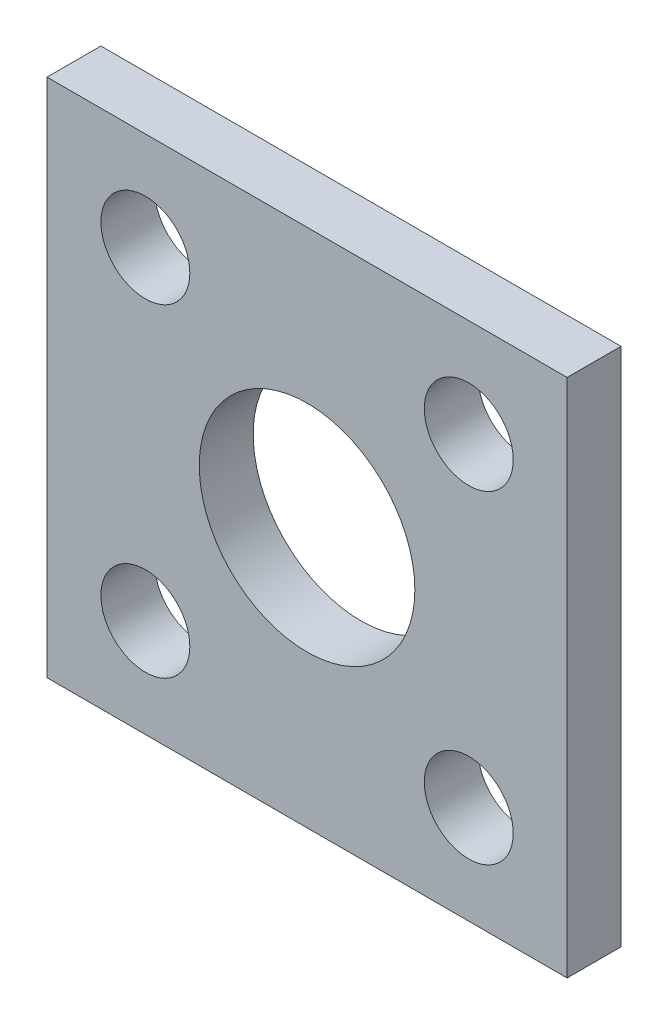
ISO-10303-21;
HEADER;
FILE_DESCRIPTION(('STEP AP214'),'2;1');
FILE_NAME('part.step','',(''),(''),'','','');
FILE_SCHEMA(('AUTOMOTIVE_DESIGN { 1 0 10303 214 1 1 1 1 }'));
ENDSEC;
DATA;
#1=APPLICATION_CONTEXT('core data for automotive mechanical design processes');
#2=APPLICATION_PROTOCOL_DEFINITION('international standard','automotive_design',2000,#1);
#3=PRODUCT_CONTEXT('',#1,'mechanical');
#4=PRODUCT('Part','Part','',(#3));
#5=PRODUCT_RELATED_PRODUCT_CATEGORY('part','',(#4));
#6=PRODUCT_DEFINITION_FORMATION('','',#4);
#7=PRODUCT_DEFINITION_CONTEXT('part definition',#1,'design');
#8=PRODUCT_DEFINITION('design','',#6,#7);
#9=PRODUCT_DEFINITION_SHAPE('','',#8);
#10=(LENGTH_UNIT() NAMED_UNIT(*) SI_UNIT(.MILLI.,.METRE.));
#11=(NAMED_UNIT(*) PLANE_ANGLE_UNIT() SI_UNIT($,.RADIAN.));
#12=(NAMED_UNIT(*) SI_UNIT($,.STERADIAN.) SOLID_ANGLE_UNIT());
#13=UNCERTAINTY_MEASURE_WITH_UNIT(LENGTH_MEASURE(1.E-05),#10,'distance_accuracy_value','');
#14=(GEOMETRIC_REPRESENTATION_CONTEXT(3) GLOBAL_UNCERTAINTY_ASSIGNED_CONTEXT((#13)) GLOBAL_UNIT_ASSIGNED_CONTEXT((#10,
#11,#12)) REPRESENTATION_CONTEXT('',''));
#15=CARTESIAN_POINT('',(0.,0.,0.));
#16=DIRECTION('',(0.,0.,1.));
#17=DIRECTION('',(1.,0.,0.));
#18=AXIS2_PLACEMENT_3D('',#15,#16,#17);
#19=CARTESIAN_POINT('',(0.,0.,5.));
#20=DIRECTION('',(0.,1.,0.));
#21=DIRECTION('',(0.,0.,1.));
#22=AXIS2_PLACEMENT_3D('',#19,#20,#21);
#23=PLANE('',#22);
#24=DIRECTION('',(1.,0.,0.));
#25=VECTOR('',#24,1.);
#26=CARTESIAN_POINT('',(0.,0.,0.));
#27=LINE('',#26,#25);
#28=CARTESIAN_POINT('',(0.,0.,0.));
#29=VERTEX_POINT('',#28);
#30=CARTESIAN_POINT('',(48.25,0.,0.));
#31=VERTEX_POINT('',#30);
#32=EDGE_CURVE('E115',#29,#31,#27,.T.);
#33=ORIENTED_EDGE('',*,*,#32,.T.);
#34=DIRECTION('',(0.,0.,-1.));
#35=VECTOR('',#34,1.);
#36=CARTESIAN_POINT('',(48.25,0.,5.));
#37=LINE('',#36,#35);
#38=CARTESIAN_POINT('',(48.25,0.,5.));
#39=VERTEX_POINT('',#38);
#40=EDGE_CURVE('E11',#39,#31,#37,.T.);
#41=ORIENTED_EDGE('',*,*,#40,.F.);
#42=DIRECTION('',(1.,0.,0.));
#43=VECTOR('',#42,1.);
#44=CARTESIAN_POINT('',(0.,0.,5.));
#45=LINE('',#44,#43);
#46=CARTESIAN_POINT('',(0.,0.,5.));
#47=VERTEX_POINT('',#46);
#48=EDGE_CURVE('E86',#47,#39,#45,.T.);
#49=ORIENTED_EDGE('',*,*,#48,.F.);
#50=DIRECTION('',(0.,0.,-1.));
#51=VECTOR('',#50,1.);
#52=CARTESIAN_POINT('',(0.,0.,5.));
#53=LINE('',#52,#51);
#54=EDGE_CURVE('E52',#47,#29,#53,.T.);
#55=ORIENTED_EDGE('',*,*,#54,.T.);
#56=EDGE_LOOP('',(#33,#41,#49,#55));
#57=FACE_BOUND('',#56,.T.);
#58=ADVANCED_FACE('F35',(#57),#23,.F.);
#59=CARTESIAN_POINT('',(48.25,0.,5.));
#60=DIRECTION('',(-1.,0.,0.));
#61=DIRECTION('',(0.,-1.,0.));
#62=AXIS2_PLACEMENT_3D('',#59,#60,#61);
#63=PLANE('',#62);
#64=DIRECTION('',(0.,1.,0.));
#65=VECTOR('',#64,1.);
#66=CARTESIAN_POINT('',(48.25,0.,0.));
#67=LINE('',#66,#65);
#68=CARTESIAN_POINT('',(48.25,48.25,0.));
#69=VERTEX_POINT('',#68);
#70=EDGE_CURVE('E91',#31,#69,#67,.T.);
#71=ORIENTED_EDGE('',*,*,#70,.T.);
#72=DIRECTION('',(0.,0.,-1.));
#73=VECTOR('',#72,1.);
#74=CARTESIAN_POINT('',(48.25,48.25,5.));
#75=LINE('',#74,#73);
#76=CARTESIAN_POINT('',(48.25,48.25,5.));
#77=VERTEX_POINT('',#76);
#78=EDGE_CURVE('E44',#77,#69,#75,.T.);
#79=ORIENTED_EDGE('',*,*,#78,.F.);
#80=DIRECTION('',(0.,1.,0.));
#81=VECTOR('',#80,1.);
#82=CARTESIAN_POINT('',(48.25,0.,5.));
#83=LINE('',#82,#81);
#84=EDGE_CURVE('E77',#39,#77,#83,.T.);
#85=ORIENTED_EDGE('',*,*,#84,.F.);
#86=ORIENTED_EDGE('',*,*,#40,.T.);
#87=EDGE_LOOP('',(#71,#79,#85,#86));
#88=FACE_BOUND('',#87,.T.);
#89=ADVANCED_FACE('F90',(#88),#63,.F.);
#90=CARTESIAN_POINT('',(0.,48.25,5.));
#91=DIRECTION('',(0.,1.,0.));
#92=DIRECTION('',(0.,0.,1.));
#93=AXIS2_PLACEMENT_3D('',#90,#91,#92);
#94=PLANE('',#93);
#95=DIRECTION('',(1.,0.,0.));
#96=VECTOR('',#95,1.);
#97=CARTESIAN_POINT('',(0.,48.25,0.));
#98=LINE('',#97,#96);
#99=CARTESIAN_POINT('',(0.,48.25,0.));
#100=VERTEX_POINT('',#99);
#101=EDGE_CURVE('E118',#100,#69,#98,.T.);
#102=ORIENTED_EDGE('',*,*,#101,.F.);
#103=DIRECTION('',(0.,0.,-1.));
#104=VECTOR('',#103,1.);
#105=CARTESIAN_POINT('',(0.,48.25,5.));
#106=LINE('',#105,#104);
#107=CARTESIAN_POINT('',(0.,48.25,5.));
#108=VERTEX_POINT('',#107);
#109=EDGE_CURVE('E66',#108,#100,#106,.T.);
#110=ORIENTED_EDGE('',*,*,#109,.F.);
#111=DIRECTION('',(1.,0.,0.));
#112=VECTOR('',#111,1.);
#113=CARTESIAN_POINT('',(0.,48.25,5.));
#114=LINE('',#113,#112);
#115=EDGE_CURVE('E85',#108,#77,#114,.T.);
#116=ORIENTED_EDGE('',*,*,#115,.T.);
#117=ORIENTED_EDGE('',*,*,#78,.T.);
#118=EDGE_LOOP('',(#102,#110,#116,#117));
#119=FACE_BOUND('',#118,.T.);
#120=ADVANCED_FACE('F94',(#119),#94,.T.);
#121=CARTESIAN_POINT('',(9.125,9.12500000000001,5.));
#122=DIRECTION('',(0.,0.,-1.));
#123=DIRECTION('',(-1.,0.,0.));
#124=AXIS2_PLACEMENT_3D('',#121,#122,#123);
#125=CYLINDRICAL_SURFACE('',#124,4.125);
#126=CARTESIAN_POINT('',(9.125,9.12500000000001,5.));
#127=DIRECTION('',(0.,0.,1.));
#128=DIRECTION('',(1.,0.,0.));
#129=AXIS2_PLACEMENT_3D('',#126,#127,#128);
#130=CIRCLE('',#129,4.125);
#131=CARTESIAN_POINT('',(13.25,9.12500000000001,5.));
#132=VERTEX_POINT('',#131);
#133=EDGE_CURVE('E103',#132,#132,#130,.T.);
#134=ORIENTED_EDGE('',*,*,#133,.T.);
#135=EDGE_LOOP('',(#134));
#136=FACE_BOUND('',#135,.T.);
#137=CARTESIAN_POINT('',(9.125,9.12500000000001,0.));
#138=DIRECTION('',(0.,0.,1.));
#139=DIRECTION('',(1.,0.,0.));
#140=AXIS2_PLACEMENT_3D('',#137,#138,#139);
#141=CIRCLE('',#140,4.125);
#142=CARTESIAN_POINT('',(13.25,9.12500000000001,0.));
#143=VERTEX_POINT('',#142);
#144=EDGE_CURVE('E126',#143,#143,#141,.T.);
#145=ORIENTED_EDGE('',*,*,#144,.F.);
#146=EDGE_LOOP('',(#145));
#147=FACE_BOUND('',#146,.T.);
#148=ADVANCED_FACE('F179',(#136,#147),#125,.F.);
#149=CARTESIAN_POINT('',(39.125,39.125,5.));
#150=DIRECTION('',(0.,0.,-1.));
#151=DIRECTION('',(-1.,0.,0.));
#152=AXIS2_PLACEMENT_3D('',#149,#150,#151);
#153=CYLINDRICAL_SURFACE('',#152,4.12499999999999);
#154=CARTESIAN_POINT('',(39.125,39.125,5.));
#155=DIRECTION('',(0.,0.,1.));
#156=DIRECTION('',(1.,0.,0.));
#157=AXIS2_PLACEMENT_3D('',#154,#155,#156);
#158=CIRCLE('',#157,4.12499999999999);
#159=CARTESIAN_POINT('',(43.25,39.125,5.));
#160=VERTEX_POINT('',#159);
#161=EDGE_CURVE('E97',#160,#160,#158,.T.);
#162=ORIENTED_EDGE('',*,*,#161,.T.);
#163=EDGE_LOOP('',(#162));
#164=FACE_BOUND('',#163,.T.);
#165=CARTESIAN_POINT('',(39.125,39.125,0.));
#166=DIRECTION('',(0.,0.,1.));
#167=DIRECTION('',(1.,0.,0.));
#168=AXIS2_PLACEMENT_3D('',#165,#166,#167);
#169=CIRCLE('',#168,4.12499999999999);
#170=CARTESIAN_POINT('',(43.25,39.125,0.));
#171=VERTEX_POINT('',#170);
#172=EDGE_CURVE('E123',#171,#171,#169,.T.);
#173=ORIENTED_EDGE('',*,*,#172,.F.);
#174=EDGE_LOOP('',(#173));
#175=FACE_BOUND('',#174,.T.);
#176=ADVANCED_FACE('F174',(#164,#175),#153,.F.);
#177=CARTESIAN_POINT('',(0.,0.,5.));
#178=DIRECTION('',(-1.,0.,0.));
#179=DIRECTION('',(0.,-1.,0.));
#180=AXIS2_PLACEMENT_3D('',#177,#178,#179);
#181=PLANE('',#180);
#182=DIRECTION('',(0.,1.,0.));
#183=VECTOR('',#182,1.);
#184=CARTESIAN_POINT('',(0.,0.,0.));
#185=LINE('',#184,#183);
#186=EDGE_CURVE('E120',#29,#100,#185,.T.);
#187=ORIENTED_EDGE('',*,*,#186,.F.);
#188=ORIENTED_EDGE('',*,*,#54,.F.);
#189=DIRECTION('',(0.,1.,0.));
#190=VECTOR('',#189,1.);
#191=CARTESIAN_POINT('',(0.,0.,5.));
#192=LINE('',#191,#190);
#193=EDGE_CURVE('E95',#47,#108,#192,.T.);
#194=ORIENTED_EDGE('',*,*,#193,.T.);
#195=ORIENTED_EDGE('',*,*,#109,.T.);
#196=EDGE_LOOP('',(#187,#188,#194,#195));
#197=FACE_BOUND('',#196,.T.);
#198=ADVANCED_FACE('F168',(#197),#181,.T.);
#199=CARTESIAN_POINT('',(24.125,24.125,5.));
#200=DIRECTION('',(0.,0.,-1.));
#201=DIRECTION('',(-1.,0.,0.));
#202=AXIS2_PLACEMENT_3D('',#199,#200,#201);
#203=CYLINDRICAL_SURFACE('',#202,10.);
#204=CARTESIAN_POINT('',(24.125,24.125,5.));
#205=DIRECTION('',(0.,0.,1.));
#206=DIRECTION('',(1.,0.,0.));
#207=AXIS2_PLACEMENT_3D('',#204,#205,#206);
#208=CIRCLE('',#207,10.);
#209=CARTESIAN_POINT('',(34.125,24.125,5.));
#210=VERTEX_POINT('',#209);
#211=EDGE_CURVE('E137',#210,#210,#208,.T.);
#212=ORIENTED_EDGE('',*,*,#211,.T.);
#213=EDGE_LOOP('',(#212));
#214=FACE_BOUND('',#213,.T.);
#215=CARTESIAN_POINT('',(24.125,24.125,0.));
#216=DIRECTION('',(0.,0.,1.));
#217=DIRECTION('',(1.,0.,0.));
#218=AXIS2_PLACEMENT_3D('',#215,#216,#217);
#219=CIRCLE('',#218,10.);
#220=CARTESIAN_POINT('',(34.125,24.125,0.));
#221=VERTEX_POINT('',#220);
#222=EDGE_CURVE('E112',#221,#221,#219,.T.);
#223=ORIENTED_EDGE('',*,*,#222,.F.);
#224=EDGE_LOOP('',(#223));
#225=FACE_BOUND('',#224,.T.);
#226=ADVANCED_FACE('F145',(#214,#225),#203,.F.);
#227=CARTESIAN_POINT('',(9.125,39.125,5.));
#228=DIRECTION('',(0.,0.,-1.));
#229=DIRECTION('',(-1.,0.,0.));
#230=AXIS2_PLACEMENT_3D('',#227,#228,#229);
#231=CYLINDRICAL_SURFACE('',#230,4.125);
#232=CARTESIAN_POINT('',(9.125,39.125,5.));
#233=DIRECTION('',(0.,0.,1.));
#234=DIRECTION('',(1.,0.,0.));
#235=AXIS2_PLACEMENT_3D('',#232,#233,#234);
#236=CIRCLE('',#235,4.125);
#237=CARTESIAN_POINT('',(13.25,39.125,5.));
#238=VERTEX_POINT('',#237);
#239=EDGE_CURVE('E132',#238,#238,#236,.F.);
#240=ORIENTED_EDGE('',*,*,#239,.F.);
#241=EDGE_LOOP('',(#240));
#242=FACE_BOUND('',#241,.T.);
#243=CARTESIAN_POINT('',(9.125,39.125,0.));
#244=DIRECTION('',(0.,0.,1.));
#245=DIRECTION('',(1.,0.,0.));
#246=AXIS2_PLACEMENT_3D('',#243,#244,#245);
#247=CIRCLE('',#246,4.125);
#248=CARTESIAN_POINT('',(13.25,39.125,0.));
#249=VERTEX_POINT('',#248);
#250=EDGE_CURVE('E109',#249,#249,#247,.F.);
#251=ORIENTED_EDGE('',*,*,#250,.T.);
#252=EDGE_LOOP('',(#251));
#253=FACE_BOUND('',#252,.T.);
#254=ADVANCED_FACE('F37',(#242,#253),#231,.F.);
#255=CARTESIAN_POINT('',(39.125,9.12500000000001,5.));
#256=DIRECTION('',(0.,0.,-1.));
#257=DIRECTION('',(-1.,0.,0.));
#258=AXIS2_PLACEMENT_3D('',#255,#256,#257);
#259=CYLINDRICAL_SURFACE('',#258,4.12499999999998);
#260=CARTESIAN_POINT('',(39.125,9.12500000000001,5.));
#261=DIRECTION('',(0.,0.,1.));
#262=DIRECTION('',(1.,0.,0.));
#263=AXIS2_PLACEMENT_3D('',#260,#261,#262);
#264=CIRCLE('',#263,4.12499999999998);
#265=CARTESIAN_POINT('',(43.25,9.12500000000001,5.));
#266=VERTEX_POINT('',#265);
#267=EDGE_CURVE('E106',#266,#266,#264,.F.);
#268=ORIENTED_EDGE('',*,*,#267,.F.);
#269=EDGE_LOOP('',(#268));
#270=FACE_BOUND('',#269,.T.);
#271=CARTESIAN_POINT('',(39.125,9.12500000000001,0.));
#272=DIRECTION('',(0.,0.,1.));
#273=DIRECTION('',(1.,0.,0.));
#274=AXIS2_PLACEMENT_3D('',#271,#272,#273);
#275=CIRCLE('',#274,4.12499999999998);
#276=CARTESIAN_POINT('',(43.25,9.12500000000001,0.));
#277=VERTEX_POINT('',#276);
#278=EDGE_CURVE('E129',#277,#277,#275,.F.);
#279=ORIENTED_EDGE('',*,*,#278,.T.);
#280=EDGE_LOOP('',(#279));
#281=FACE_BOUND('',#280,.T.);
#282=ADVANCED_FACE('F150',(#270,#281),#259,.F.);
#283=CARTESIAN_POINT('',(0.,0.,5.));
#284=DIRECTION('',(0.,0.,1.));
#285=DIRECTION('',(1.,0.,0.));
#286=AXIS2_PLACEMENT_3D('',#283,#284,#285);
#287=PLANE('',#286);
#288=ORIENTED_EDGE('',*,*,#239,.T.);
#289=EDGE_LOOP('',(#288));
#290=FACE_BOUND('',#289,.T.);
#291=ORIENTED_EDGE('',*,*,#211,.F.);
#292=EDGE_LOOP('',(#291));
#293=FACE_BOUND('',#292,.T.);
#294=ORIENTED_EDGE('',*,*,#48,.T.);
#295=ORIENTED_EDGE('',*,*,#84,.T.);
#296=ORIENTED_EDGE('',*,*,#115,.F.);
#297=ORIENTED_EDGE('',*,*,#193,.F.);
#298=EDGE_LOOP('',(#294,#295,#296,#297));
#299=FACE_BOUND('',#298,.T.);
#300=ORIENTED_EDGE('',*,*,#161,.F.);
#301=EDGE_LOOP('',(#300));
#302=FACE_BOUND('',#301,.T.);
#303=ORIENTED_EDGE('',*,*,#133,.F.);
#304=EDGE_LOOP('',(#303));
#305=FACE_BOUND('',#304,.T.);
#306=ORIENTED_EDGE('',*,*,#267,.T.);
#307=EDGE_LOOP('',(#306));
#308=FACE_BOUND('',#307,.T.);
#309=ADVANCED_FACE('F81',(#290,#293,#299,#302,#305,#308),#287,.T.);
#310=CARTESIAN_POINT('',(0.,0.,0.));
#311=DIRECTION('',(0.,0.,1.));
#312=DIRECTION('',(1.,0.,0.));
#313=AXIS2_PLACEMENT_3D('',#310,#311,#312);
#314=PLANE('',#313);
#315=ORIENTED_EDGE('',*,*,#250,.F.);
#316=EDGE_LOOP('',(#315));
#317=FACE_BOUND('',#316,.T.);
#318=ORIENTED_EDGE('',*,*,#222,.T.);
#319=EDGE_LOOP('',(#318));
#320=FACE_BOUND('',#319,.T.);
#321=ORIENTED_EDGE('',*,*,#32,.F.);
#322=ORIENTED_EDGE('',*,*,#186,.T.);
#323=ORIENTED_EDGE('',*,*,#101,.T.);
#324=ORIENTED_EDGE('',*,*,#70,.F.);
#325=EDGE_LOOP('',(#321,#322,#323,#324));
#326=FACE_BOUND('',#325,.T.);
#327=ORIENTED_EDGE('',*,*,#172,.T.);
#328=EDGE_LOOP('',(#327));
#329=FACE_BOUND('',#328,.T.);
#330=ORIENTED_EDGE('',*,*,#144,.T.);
#331=EDGE_LOOP('',(#330));
#332=FACE_BOUND('',#331,.T.);
#333=ORIENTED_EDGE('',*,*,#278,.F.);
#334=EDGE_LOOP('',(#333));
#335=FACE_BOUND('',#334,.T.);
#336=ADVANCED_FACE('F149',(#317,#320,#326,#329,#332,#335),#314,.F.);
#337=CLOSED_SHELL('',(#58,#89,#120,#148,#176,#198,#226,#254,#282,#309,#336));
#338=MANIFOLD_SOLID_BREP('B2',#337);
#339=ADVANCED_BREP_SHAPE_REPRESENTATION('',(#18,#338),#14);
#340=SHAPE_DEFINITION_REPRESENTATION(#9,#339);
ENDSEC;
END-ISO-10303-21;
